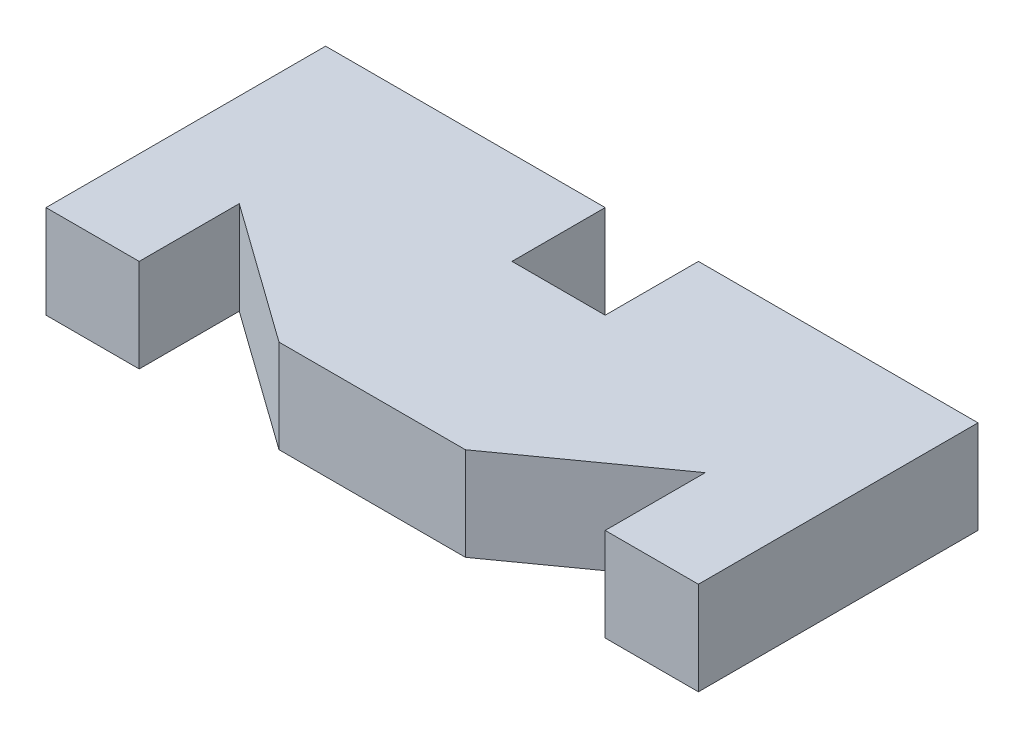
ISO-10303-21;
HEADER;
FILE_DESCRIPTION(('STEP AP214'),'2;1');
FILE_NAME('part.step','',(''),(''),'','','');
FILE_SCHEMA(('AUTOMOTIVE_DESIGN { 1 0 10303 214 1 1 1 1 }'));
ENDSEC;
DATA;
#1=APPLICATION_CONTEXT('core data for automotive mechanical design processes');
#2=APPLICATION_PROTOCOL_DEFINITION('international standard','automotive_design',2000,#1);
#3=PRODUCT_CONTEXT('',#1,'mechanical');
#4=PRODUCT('Part','Part','',(#3));
#5=PRODUCT_RELATED_PRODUCT_CATEGORY('part','',(#4));
#6=PRODUCT_DEFINITION_FORMATION('','',#4);
#7=PRODUCT_DEFINITION_CONTEXT('part definition',#1,'design');
#8=PRODUCT_DEFINITION('design','',#6,#7);
#9=PRODUCT_DEFINITION_SHAPE('','',#8);
#10=(LENGTH_UNIT() NAMED_UNIT(*) SI_UNIT(.MILLI.,.METRE.));
#11=(NAMED_UNIT(*) PLANE_ANGLE_UNIT() SI_UNIT($,.RADIAN.));
#12=(NAMED_UNIT(*) SI_UNIT($,.STERADIAN.) SOLID_ANGLE_UNIT());
#13=UNCERTAINTY_MEASURE_WITH_UNIT(LENGTH_MEASURE(1.E-05),#10,'distance_accuracy_value','');
#14=(GEOMETRIC_REPRESENTATION_CONTEXT(3) GLOBAL_UNCERTAINTY_ASSIGNED_CONTEXT((#13)) GLOBAL_UNIT_ASSIGNED_CONTEXT((#10,
#11,#12)) REPRESENTATION_CONTEXT('',''));
#15=CARTESIAN_POINT('',(0.,0.,0.));
#16=DIRECTION('',(0.,0.,1.));
#17=DIRECTION('',(1.,0.,0.));
#18=AXIS2_PLACEMENT_3D('',#15,#16,#17);
#19=CARTESIAN_POINT('',(25.,10.,15.));
#20=DIRECTION('',(0.,0.,-1.));
#21=DIRECTION('',(-1.,0.,0.));
#22=AXIS2_PLACEMENT_3D('',#19,#20,#21);
#23=PLANE('',#22);
#24=DIRECTION('',(1.,0.,0.));
#25=VECTOR('',#24,1.);
#26=CARTESIAN_POINT('',(25.,0.,15.));
#27=LINE('',#26,#25);
#28=CARTESIAN_POINT('',(25.,0.,15.));
#29=VERTEX_POINT('',#28);
#30=CARTESIAN_POINT('',(35.,0.,15.));
#31=VERTEX_POINT('',#30);
#32=EDGE_CURVE('E177',#29,#31,#27,.T.);
#33=ORIENTED_EDGE('',*,*,#32,.T.);
#34=DIRECTION('',(0.,-1.,0.));
#35=VECTOR('',#34,1.);
#36=CARTESIAN_POINT('',(35.,10.,15.));
#37=LINE('',#36,#35);
#38=CARTESIAN_POINT('',(35.,10.,15.));
#39=VERTEX_POINT('',#38);
#40=EDGE_CURVE('E11',#39,#31,#37,.T.);
#41=ORIENTED_EDGE('',*,*,#40,.F.);
#42=DIRECTION('',(1.,0.,0.));
#43=VECTOR('',#42,1.);
#44=CARTESIAN_POINT('',(25.,10.,15.));
#45=LINE('',#44,#43);
#46=CARTESIAN_POINT('',(25.,10.,15.));
#47=VERTEX_POINT('',#46);
#48=EDGE_CURVE('E203',#47,#39,#45,.T.);
#49=ORIENTED_EDGE('',*,*,#48,.F.);
#50=DIRECTION('',(0.,-1.,0.));
#51=VECTOR('',#50,1.);
#52=CARTESIAN_POINT('',(25.,10.,15.));
#53=LINE('',#52,#51);
#54=EDGE_CURVE('E173',#47,#29,#53,.T.);
#55=ORIENTED_EDGE('',*,*,#54,.T.);
#56=EDGE_LOOP('',(#33,#41,#49,#55));
#57=FACE_BOUND('',#56,.T.);
#58=ADVANCED_FACE('F45',(#57),#23,.F.);
#59=CARTESIAN_POINT('',(35.,10.,-15.));
#60=DIRECTION('',(-1.,0.,0.));
#61=DIRECTION('',(0.,0.,1.));
#62=AXIS2_PLACEMENT_3D('',#59,#60,#61);
#63=PLANE('',#62);
#64=DIRECTION('',(0.,0.,-1.));
#65=VECTOR('',#64,1.);
#66=CARTESIAN_POINT('',(35.,0.,-15.));
#67=LINE('',#66,#65);
#68=CARTESIAN_POINT('',(35.,0.,-15.));
#69=VERTEX_POINT('',#68);
#70=EDGE_CURVE('E180',#31,#69,#67,.T.);
#71=ORIENTED_EDGE('',*,*,#70,.T.);
#72=DIRECTION('',(0.,-1.,0.));
#73=VECTOR('',#72,1.);
#74=CARTESIAN_POINT('',(35.,10.,-15.));
#75=LINE('',#74,#73);
#76=CARTESIAN_POINT('',(35.,10.,-15.));
#77=VERTEX_POINT('',#76);
#78=EDGE_CURVE('E53',#77,#69,#75,.T.);
#79=ORIENTED_EDGE('',*,*,#78,.F.);
#80=DIRECTION('',(0.,0.,-1.));
#81=VECTOR('',#80,1.);
#82=CARTESIAN_POINT('',(35.,10.,-15.));
#83=LINE('',#82,#81);
#84=EDGE_CURVE('E122',#39,#77,#83,.T.);
#85=ORIENTED_EDGE('',*,*,#84,.F.);
#86=ORIENTED_EDGE('',*,*,#40,.T.);
#87=EDGE_LOOP('',(#71,#79,#85,#86));
#88=FACE_BOUND('',#87,.T.);
#89=ADVANCED_FACE('F291',(#88),#63,.F.);
#90=CARTESIAN_POINT('',(4.99999999999999,10.,-15.));
#91=DIRECTION('',(0.,0.,1.));
#92=DIRECTION('',(1.,0.,0.));
#93=AXIS2_PLACEMENT_3D('',#90,#91,#92);
#94=PLANE('',#93);
#95=DIRECTION('',(-1.,0.,0.));
#96=VECTOR('',#95,1.);
#97=CARTESIAN_POINT('',(4.99999999999999,0.,-15.));
#98=LINE('',#97,#96);
#99=CARTESIAN_POINT('',(4.99999999999999,0.,-15.));
#100=VERTEX_POINT('',#99);
#101=EDGE_CURVE('E182',#69,#100,#98,.T.);
#102=ORIENTED_EDGE('',*,*,#101,.T.);
#103=DIRECTION('',(0.,-1.,0.));
#104=VECTOR('',#103,1.);
#105=CARTESIAN_POINT('',(4.99999999999999,10.,-15.));
#106=LINE('',#105,#104);
#107=CARTESIAN_POINT('',(4.99999999999999,10.,-15.));
#108=VERTEX_POINT('',#107);
#109=EDGE_CURVE('E228',#108,#100,#106,.T.);
#110=ORIENTED_EDGE('',*,*,#109,.F.);
#111=DIRECTION('',(-1.,0.,0.));
#112=VECTOR('',#111,1.);
#113=CARTESIAN_POINT('',(4.99999999999999,10.,-15.));
#114=LINE('',#113,#112);
#115=EDGE_CURVE('E236',#77,#108,#114,.T.);
#116=ORIENTED_EDGE('',*,*,#115,.F.);
#117=ORIENTED_EDGE('',*,*,#78,.T.);
#118=EDGE_LOOP('',(#102,#110,#116,#117));
#119=FACE_BOUND('',#118,.T.);
#120=ADVANCED_FACE('F234',(#119),#94,.F.);
#121=CARTESIAN_POINT('',(4.99999999999999,10.,-5.));
#122=DIRECTION('',(1.,0.,0.));
#123=DIRECTION('',(0.,0.,-1.));
#124=AXIS2_PLACEMENT_3D('',#121,#122,#123);
#125=PLANE('',#124);
#126=DIRECTION('',(0.,0.,1.));
#127=VECTOR('',#126,1.);
#128=CARTESIAN_POINT('',(4.99999999999999,0.,-5.));
#129=LINE('',#128,#127);
#130=CARTESIAN_POINT('',(4.99999999999999,0.,-5.));
#131=VERTEX_POINT('',#130);
#132=EDGE_CURVE('E184',#100,#131,#129,.T.);
#133=ORIENTED_EDGE('',*,*,#132,.T.);
#134=DIRECTION('',(0.,-1.,0.));
#135=VECTOR('',#134,1.);
#136=CARTESIAN_POINT('',(4.99999999999999,10.,-5.));
#137=LINE('',#136,#135);
#138=CARTESIAN_POINT('',(4.99999999999999,10.,-5.));
#139=VERTEX_POINT('',#138);
#140=EDGE_CURVE('E225',#139,#131,#137,.T.);
#141=ORIENTED_EDGE('',*,*,#140,.F.);
#142=DIRECTION('',(0.,0.,1.));
#143=VECTOR('',#142,1.);
#144=CARTESIAN_POINT('',(4.99999999999999,10.,-5.));
#145=LINE('',#144,#143);
#146=EDGE_CURVE('E254',#108,#139,#145,.T.);
#147=ORIENTED_EDGE('',*,*,#146,.F.);
#148=ORIENTED_EDGE('',*,*,#109,.T.);
#149=EDGE_LOOP('',(#133,#141,#147,#148));
#150=FACE_BOUND('',#149,.T.);
#151=ADVANCED_FACE('F245',(#150),#125,.F.);
#152=CARTESIAN_POINT('',(-5.00000000000001,10.,-5.));
#153=DIRECTION('',(0.,0.,1.));
#154=DIRECTION('',(1.,0.,0.));
#155=AXIS2_PLACEMENT_3D('',#152,#153,#154);
#156=PLANE('',#155);
#157=DIRECTION('',(-1.,0.,0.));
#158=VECTOR('',#157,1.);
#159=CARTESIAN_POINT('',(-5.00000000000001,0.,-5.));
#160=LINE('',#159,#158);
#161=CARTESIAN_POINT('',(-5.00000000000001,0.,-5.));
#162=VERTEX_POINT('',#161);
#163=EDGE_CURVE('E186',#131,#162,#160,.T.);
#164=ORIENTED_EDGE('',*,*,#163,.T.);
#165=DIRECTION('',(0.,-1.,0.));
#166=VECTOR('',#165,1.);
#167=CARTESIAN_POINT('',(-5.00000000000001,10.,-5.));
#168=LINE('',#167,#166);
#169=CARTESIAN_POINT('',(-5.00000000000001,10.,-5.));
#170=VERTEX_POINT('',#169);
#171=EDGE_CURVE('E222',#170,#162,#168,.T.);
#172=ORIENTED_EDGE('',*,*,#171,.F.);
#173=DIRECTION('',(-1.,0.,0.));
#174=VECTOR('',#173,1.);
#175=CARTESIAN_POINT('',(-5.00000000000001,10.,-5.));
#176=LINE('',#175,#174);
#177=EDGE_CURVE('E251',#139,#170,#176,.T.);
#178=ORIENTED_EDGE('',*,*,#177,.F.);
#179=ORIENTED_EDGE('',*,*,#140,.T.);
#180=EDGE_LOOP('',(#164,#172,#178,#179));
#181=FACE_BOUND('',#180,.T.);
#182=ADVANCED_FACE('F249',(#181),#156,.F.);
#183=CARTESIAN_POINT('',(-5.00000000000001,10.,-15.));
#184=DIRECTION('',(-1.,0.,0.));
#185=DIRECTION('',(0.,0.,1.));
#186=AXIS2_PLACEMENT_3D('',#183,#184,#185);
#187=PLANE('',#186);
#188=DIRECTION('',(0.,0.,-1.));
#189=VECTOR('',#188,1.);
#190=CARTESIAN_POINT('',(-5.00000000000001,0.,-15.));
#191=LINE('',#190,#189);
#192=CARTESIAN_POINT('',(-5.00000000000001,0.,-15.));
#193=VERTEX_POINT('',#192);
#194=EDGE_CURVE('E188',#162,#193,#191,.T.);
#195=ORIENTED_EDGE('',*,*,#194,.T.);
#196=DIRECTION('',(0.,-1.,0.));
#197=VECTOR('',#196,1.);
#198=CARTESIAN_POINT('',(-5.00000000000001,10.,-15.));
#199=LINE('',#198,#197);
#200=CARTESIAN_POINT('',(-5.00000000000001,10.,-15.));
#201=VERTEX_POINT('',#200);
#202=EDGE_CURVE('E219',#201,#193,#199,.T.);
#203=ORIENTED_EDGE('',*,*,#202,.F.);
#204=DIRECTION('',(0.,0.,-1.));
#205=VECTOR('',#204,1.);
#206=CARTESIAN_POINT('',(-5.00000000000001,10.,-15.));
#207=LINE('',#206,#205);
#208=EDGE_CURVE('E253',#170,#201,#207,.T.);
#209=ORIENTED_EDGE('',*,*,#208,.F.);
#210=ORIENTED_EDGE('',*,*,#171,.T.);
#211=EDGE_LOOP('',(#195,#203,#209,#210));
#212=FACE_BOUND('',#211,.T.);
#213=ADVANCED_FACE('F304',(#212),#187,.F.);
#214=CARTESIAN_POINT('',(-35.,10.,-15.));
#215=DIRECTION('',(0.,0.,1.));
#216=DIRECTION('',(1.,0.,0.));
#217=AXIS2_PLACEMENT_3D('',#214,#215,#216);
#218=PLANE('',#217);
#219=DIRECTION('',(-1.,0.,0.));
#220=VECTOR('',#219,1.);
#221=CARTESIAN_POINT('',(-35.,0.,-15.));
#222=LINE('',#221,#220);
#223=CARTESIAN_POINT('',(-35.,0.,-15.));
#224=VERTEX_POINT('',#223);
#225=EDGE_CURVE('E190',#193,#224,#222,.T.);
#226=ORIENTED_EDGE('',*,*,#225,.T.);
#227=DIRECTION('',(0.,-1.,0.));
#228=VECTOR('',#227,1.);
#229=CARTESIAN_POINT('',(-35.,10.,-15.));
#230=LINE('',#229,#228);
#231=CARTESIAN_POINT('',(-35.,10.,-15.));
#232=VERTEX_POINT('',#231);
#233=EDGE_CURVE('E216',#232,#224,#230,.T.);
#234=ORIENTED_EDGE('',*,*,#233,.F.);
#235=DIRECTION('',(-1.,0.,0.));
#236=VECTOR('',#235,1.);
#237=CARTESIAN_POINT('',(-35.,10.,-15.));
#238=LINE('',#237,#236);
#239=EDGE_CURVE('E256',#201,#232,#238,.T.);
#240=ORIENTED_EDGE('',*,*,#239,.F.);
#241=ORIENTED_EDGE('',*,*,#202,.T.);
#242=EDGE_LOOP('',(#226,#234,#240,#241));
#243=FACE_BOUND('',#242,.T.);
#244=ADVANCED_FACE('F307',(#243),#218,.F.);
#245=CARTESIAN_POINT('',(-35.,10.,-15.));
#246=DIRECTION('',(1.,0.,0.));
#247=DIRECTION('',(0.,0.,-1.));
#248=AXIS2_PLACEMENT_3D('',#245,#246,#247);
#249=PLANE('',#248);
#250=DIRECTION('',(0.,0.,1.));
#251=VECTOR('',#250,1.);
#252=CARTESIAN_POINT('',(-35.,0.,-15.));
#253=LINE('',#252,#251);
#254=CARTESIAN_POINT('',(-35.,0.,15.));
#255=VERTEX_POINT('',#254);
#256=EDGE_CURVE('E192',#224,#255,#253,.T.);
#257=ORIENTED_EDGE('',*,*,#256,.T.);
#258=DIRECTION('',(0.,-1.,0.));
#259=VECTOR('',#258,1.);
#260=CARTESIAN_POINT('',(-35.,10.,15.));
#261=LINE('',#260,#259);
#262=CARTESIAN_POINT('',(-35.,10.,15.));
#263=VERTEX_POINT('',#262);
#264=EDGE_CURVE('E213',#263,#255,#261,.T.);
#265=ORIENTED_EDGE('',*,*,#264,.F.);
#266=DIRECTION('',(0.,0.,1.));
#267=VECTOR('',#266,1.);
#268=CARTESIAN_POINT('',(-35.,10.,-15.));
#269=LINE('',#268,#267);
#270=EDGE_CURVE('E262',#232,#263,#269,.T.);
#271=ORIENTED_EDGE('',*,*,#270,.F.);
#272=ORIENTED_EDGE('',*,*,#233,.T.);
#273=EDGE_LOOP('',(#257,#265,#271,#272));
#274=FACE_BOUND('',#273,.T.);
#275=ADVANCED_FACE('F311',(#274),#249,.F.);
#276=CARTESIAN_POINT('',(-35.,10.,15.));
#277=DIRECTION('',(0.,0.,-1.));
#278=DIRECTION('',(-1.,0.,0.));
#279=AXIS2_PLACEMENT_3D('',#276,#277,#278);
#280=PLANE('',#279);
#281=DIRECTION('',(1.,0.,0.));
#282=VECTOR('',#281,1.);
#283=CARTESIAN_POINT('',(-35.,0.,15.));
#284=LINE('',#283,#282);
#285=CARTESIAN_POINT('',(-25.,0.,15.));
#286=VERTEX_POINT('',#285);
#287=EDGE_CURVE('E194',#255,#286,#284,.T.);
#288=ORIENTED_EDGE('',*,*,#287,.T.);
#289=DIRECTION('',(0.,-1.,0.));
#290=VECTOR('',#289,1.);
#291=CARTESIAN_POINT('',(-25.,10.,15.));
#292=LINE('',#291,#290);
#293=CARTESIAN_POINT('',(-25.,10.,15.));
#294=VERTEX_POINT('',#293);
#295=EDGE_CURVE('E210',#294,#286,#292,.T.);
#296=ORIENTED_EDGE('',*,*,#295,.F.);
#297=DIRECTION('',(1.,0.,0.));
#298=VECTOR('',#297,1.);
#299=CARTESIAN_POINT('',(-35.,10.,15.));
#300=LINE('',#299,#298);
#301=EDGE_CURVE('E264',#263,#294,#300,.T.);
#302=ORIENTED_EDGE('',*,*,#301,.F.);
#303=ORIENTED_EDGE('',*,*,#264,.T.);
#304=EDGE_LOOP('',(#288,#296,#302,#303));
#305=FACE_BOUND('',#304,.T.);
#306=ADVANCED_FACE('F315',(#305),#280,.F.);
#307=CARTESIAN_POINT('',(-25.,10.,15.));
#308=DIRECTION('',(-1.,0.,0.));
#309=DIRECTION('',(0.,0.,1.));
#310=AXIS2_PLACEMENT_3D('',#307,#308,#309);
#311=PLANE('',#310);
#312=DIRECTION('',(0.,0.,-1.));
#313=VECTOR('',#312,1.);
#314=CARTESIAN_POINT('',(-25.,0.,15.));
#315=LINE('',#314,#313);
#316=CARTESIAN_POINT('',(-25.,0.,4.26397879022232));
#317=VERTEX_POINT('',#316);
#318=EDGE_CURVE('E196',#286,#317,#315,.T.);
#319=ORIENTED_EDGE('',*,*,#318,.T.);
#320=DIRECTION('',(0.,-1.,0.));
#321=VECTOR('',#320,1.);
#322=CARTESIAN_POINT('',(-25.,10.,4.26397879022232));
#323=LINE('',#322,#321);
#324=CARTESIAN_POINT('',(-25.,10.,4.26397879022232));
#325=VERTEX_POINT('',#324);
#326=EDGE_CURVE('E207',#325,#317,#323,.T.);
#327=ORIENTED_EDGE('',*,*,#326,.F.);
#328=DIRECTION('',(0.,0.,-1.));
#329=VECTOR('',#328,1.);
#330=CARTESIAN_POINT('',(-25.,10.,15.));
#331=LINE('',#330,#329);
#332=EDGE_CURVE('E266',#294,#325,#331,.T.);
#333=ORIENTED_EDGE('',*,*,#332,.F.);
#334=ORIENTED_EDGE('',*,*,#295,.T.);
#335=EDGE_LOOP('',(#319,#327,#333,#334));
#336=FACE_BOUND('',#335,.T.);
#337=ADVANCED_FACE('F272',(#336),#311,.F.);
#338=CARTESIAN_POINT('',(-25.,10.,4.26397879022232));
#339=DIRECTION('',(0.582018164506845,0.,-0.813175784307478));
#340=DIRECTION('',(-0.813175784307479,0.,-0.582018164506845));
#341=AXIS2_PLACEMENT_3D('',#338,#339,#340);
#342=PLANE('',#341);
#343=DIRECTION('',(0.813175784307478,0.,0.582018164506845));
#344=VECTOR('',#343,1.);
#345=CARTESIAN_POINT('',(-25.,0.,4.26397879022232));
#346=LINE('',#345,#344);
#347=CARTESIAN_POINT('',(-9.99999999999999,0.,15.));
#348=VERTEX_POINT('',#347);
#349=EDGE_CURVE('E198',#317,#348,#346,.T.);
#350=ORIENTED_EDGE('',*,*,#349,.T.);
#351=DIRECTION('',(0.,-1.,0.));
#352=VECTOR('',#351,1.);
#353=CARTESIAN_POINT('',(-9.99999999999999,10.,15.));
#354=LINE('',#353,#352);
#355=CARTESIAN_POINT('',(-9.99999999999999,10.,15.));
#356=VERTEX_POINT('',#355);
#357=EDGE_CURVE('E168',#356,#348,#354,.T.);
#358=ORIENTED_EDGE('',*,*,#357,.F.);
#359=DIRECTION('',(0.813175784307478,0.,0.582018164506845));
#360=VECTOR('',#359,1.);
#361=CARTESIAN_POINT('',(-25.,10.,4.26397879022232));
#362=LINE('',#361,#360);
#363=EDGE_CURVE('E159',#325,#356,#362,.T.);
#364=ORIENTED_EDGE('',*,*,#363,.F.);
#365=ORIENTED_EDGE('',*,*,#326,.T.);
#366=EDGE_LOOP('',(#350,#358,#364,#365));
#367=FACE_BOUND('',#366,.T.);
#368=ADVANCED_FACE('F276',(#367),#342,.F.);
#369=CARTESIAN_POINT('',(-9.99999999999999,10.,15.));
#370=DIRECTION('',(0.,0.,-1.));
#371=DIRECTION('',(-1.,0.,0.));
#372=AXIS2_PLACEMENT_3D('',#369,#370,#371);
#373=PLANE('',#372);
#374=DIRECTION('',(1.,0.,0.));
#375=VECTOR('',#374,1.);
#376=CARTESIAN_POINT('',(-9.99999999999999,0.,15.));
#377=LINE('',#376,#375);
#378=CARTESIAN_POINT('',(10.,0.,15.));
#379=VERTEX_POINT('',#378);
#380=EDGE_CURVE('E167',#348,#379,#377,.T.);
#381=ORIENTED_EDGE('',*,*,#380,.T.);
#382=DIRECTION('',(0.,-1.,0.));
#383=VECTOR('',#382,1.);
#384=CARTESIAN_POINT('',(10.,10.,15.));
#385=LINE('',#384,#383);
#386=CARTESIAN_POINT('',(10.,10.,15.));
#387=VERTEX_POINT('',#386);
#388=EDGE_CURVE('E164',#387,#379,#385,.T.);
#389=ORIENTED_EDGE('',*,*,#388,.F.);
#390=DIRECTION('',(1.,0.,0.));
#391=VECTOR('',#390,1.);
#392=CARTESIAN_POINT('',(-9.99999999999999,10.,15.));
#393=LINE('',#392,#391);
#394=EDGE_CURVE('E153',#356,#387,#393,.T.);
#395=ORIENTED_EDGE('',*,*,#394,.F.);
#396=ORIENTED_EDGE('',*,*,#357,.T.);
#397=EDGE_LOOP('',(#381,#389,#395,#396));
#398=FACE_BOUND('',#397,.T.);
#399=ADVANCED_FACE('F165',(#398),#373,.F.);
#400=CARTESIAN_POINT('',(10.,10.,15.));
#401=DIRECTION('',(-0.582018164506847,0.,-0.813175784307478));
#402=DIRECTION('',(-0.813175784307478,0.,0.582018164506847));
#403=AXIS2_PLACEMENT_3D('',#400,#401,#402);
#404=PLANE('',#403);
#405=DIRECTION('',(0.813175784307477,0.,-0.582018164506847));
#406=VECTOR('',#405,1.);
#407=CARTESIAN_POINT('',(10.,0.,15.));
#408=LINE('',#407,#406);
#409=CARTESIAN_POINT('',(25.,0.,4.26397879022228));
#410=VERTEX_POINT('',#409);
#411=EDGE_CURVE('E108',#379,#410,#408,.T.);
#412=ORIENTED_EDGE('',*,*,#411,.T.);
#413=DIRECTION('',(0.,-1.,0.));
#414=VECTOR('',#413,1.);
#415=CARTESIAN_POINT('',(25.,10.,4.26397879022228));
#416=LINE('',#415,#414);
#417=CARTESIAN_POINT('',(25.,10.,4.26397879022228));
#418=VERTEX_POINT('',#417);
#419=EDGE_CURVE('E169',#418,#410,#416,.T.);
#420=ORIENTED_EDGE('',*,*,#419,.F.);
#421=DIRECTION('',(0.813175784307477,0.,-0.582018164506847));
#422=VECTOR('',#421,1.);
#423=CARTESIAN_POINT('',(10.,10.,15.));
#424=LINE('',#423,#422);
#425=EDGE_CURVE('E157',#387,#418,#424,.T.);
#426=ORIENTED_EDGE('',*,*,#425,.F.);
#427=ORIENTED_EDGE('',*,*,#388,.T.);
#428=EDGE_LOOP('',(#412,#420,#426,#427));
#429=FACE_BOUND('',#428,.T.);
#430=ADVANCED_FACE('F171',(#429),#404,.F.);
#431=CARTESIAN_POINT('',(25.,10.,4.26397879022228));
#432=DIRECTION('',(1.,0.,0.));
#433=DIRECTION('',(0.,0.,-1.));
#434=AXIS2_PLACEMENT_3D('',#431,#432,#433);
#435=PLANE('',#434);
#436=DIRECTION('',(0.,0.,1.));
#437=VECTOR('',#436,1.);
#438=CARTESIAN_POINT('',(25.,0.,4.26397879022228));
#439=LINE('',#438,#437);
#440=EDGE_CURVE('E114',#410,#29,#439,.T.);
#441=ORIENTED_EDGE('',*,*,#440,.T.);
#442=ORIENTED_EDGE('',*,*,#54,.F.);
#443=DIRECTION('',(0.,0.,1.));
#444=VECTOR('',#443,1.);
#445=CARTESIAN_POINT('',(25.,10.,4.26397879022228));
#446=LINE('',#445,#444);
#447=EDGE_CURVE('E61',#418,#47,#446,.T.);
#448=ORIENTED_EDGE('',*,*,#447,.F.);
#449=ORIENTED_EDGE('',*,*,#419,.T.);
#450=EDGE_LOOP('',(#441,#442,#448,#449));
#451=FACE_BOUND('',#450,.T.);
#452=ADVANCED_FACE('F280',(#451),#435,.F.);
#453=CARTESIAN_POINT('',(0.,10.,0.));
#454=DIRECTION('',(0.,-1.,0.));
#455=DIRECTION('',(0.,0.,-1.));
#456=AXIS2_PLACEMENT_3D('',#453,#454,#455);
#457=PLANE('',#456);
#458=ORIENTED_EDGE('',*,*,#48,.T.);
#459=ORIENTED_EDGE('',*,*,#84,.T.);
#460=ORIENTED_EDGE('',*,*,#115,.T.);
#461=ORIENTED_EDGE('',*,*,#146,.T.);
#462=ORIENTED_EDGE('',*,*,#177,.T.);
#463=ORIENTED_EDGE('',*,*,#208,.T.);
#464=ORIENTED_EDGE('',*,*,#239,.T.);
#465=ORIENTED_EDGE('',*,*,#270,.T.);
#466=ORIENTED_EDGE('',*,*,#301,.T.);
#467=ORIENTED_EDGE('',*,*,#332,.T.);
#468=ORIENTED_EDGE('',*,*,#363,.T.);
#469=ORIENTED_EDGE('',*,*,#394,.T.);
#470=ORIENTED_EDGE('',*,*,#425,.T.);
#471=ORIENTED_EDGE('',*,*,#447,.T.);
#472=EDGE_LOOP('',(#458,#459,#460,#461,#462,#463,#464,#465,#466,#467,#468,#469,#470,#471));
#473=FACE_BOUND('',#472,.T.);
#474=ADVANCED_FACE('F155',(#473),#457,.F.);
#475=CARTESIAN_POINT('',(0.,0.,0.));
#476=DIRECTION('',(0.,-1.,0.));
#477=DIRECTION('',(0.,0.,-1.));
#478=AXIS2_PLACEMENT_3D('',#475,#476,#477);
#479=PLANE('',#478);
#480=ORIENTED_EDGE('',*,*,#32,.F.);
#481=ORIENTED_EDGE('',*,*,#440,.F.);
#482=ORIENTED_EDGE('',*,*,#411,.F.);
#483=ORIENTED_EDGE('',*,*,#380,.F.);
#484=ORIENTED_EDGE('',*,*,#349,.F.);
#485=ORIENTED_EDGE('',*,*,#318,.F.);
#486=ORIENTED_EDGE('',*,*,#287,.F.);
#487=ORIENTED_EDGE('',*,*,#256,.F.);
#488=ORIENTED_EDGE('',*,*,#225,.F.);
#489=ORIENTED_EDGE('',*,*,#194,.F.);
#490=ORIENTED_EDGE('',*,*,#163,.F.);
#491=ORIENTED_EDGE('',*,*,#132,.F.);
#492=ORIENTED_EDGE('',*,*,#101,.F.);
#493=ORIENTED_EDGE('',*,*,#70,.F.);
#494=EDGE_LOOP('',(#480,#481,#482,#483,#484,#485,#486,#487,#488,#489,#490,#491,#492,#493));
#495=FACE_BOUND('',#494,.T.);
#496=ADVANCED_FACE('F240',(#495),#479,.T.);
#497=CLOSED_SHELL('',(#58,#89,#120,#151,#182,#213,#244,#275,#306,#337,#368,#399,#430,#452,#474,#496));
#498=MANIFOLD_SOLID_BREP('B2',#497);
#499=ADVANCED_BREP_SHAPE_REPRESENTATION('',(#18,#498),#14);
#500=SHAPE_DEFINITION_REPRESENTATION(#9,#499);
ENDSEC;
END-ISO-10303-21;
